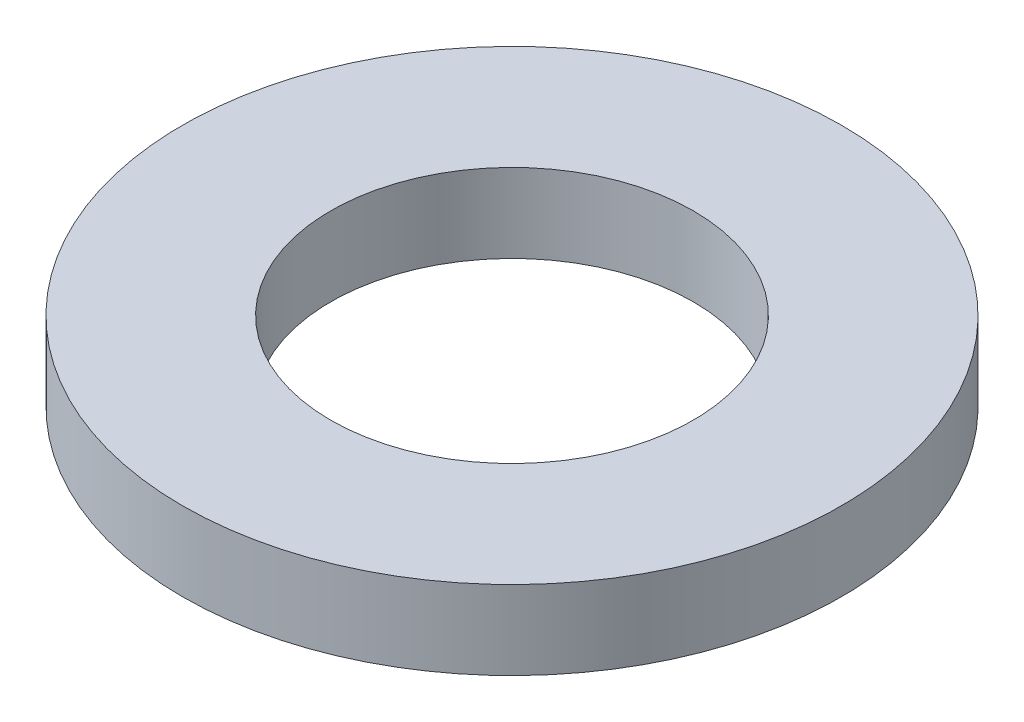
ISO-10303-21;
HEADER;
FILE_DESCRIPTION(('STEP AP214'),'2;1');
FILE_NAME('part.step','',(''),(''),'','','');
FILE_SCHEMA(('AUTOMOTIVE_DESIGN { 1 0 10303 214 1 1 1 1 }'));
ENDSEC;
DATA;
#1=APPLICATION_CONTEXT('core data for automotive mechanical design processes');
#2=APPLICATION_PROTOCOL_DEFINITION('international standard','automotive_design',2000,#1);
#3=PRODUCT_CONTEXT('',#1,'mechanical');
#4=PRODUCT('Part','Part','',(#3));
#5=PRODUCT_RELATED_PRODUCT_CATEGORY('part','',(#4));
#6=PRODUCT_DEFINITION_FORMATION('','',#4);
#7=PRODUCT_DEFINITION_CONTEXT('part definition',#1,'design');
#8=PRODUCT_DEFINITION('design','',#6,#7);
#9=PRODUCT_DEFINITION_SHAPE('','',#8);
#10=(LENGTH_UNIT() NAMED_UNIT(*) SI_UNIT(.MILLI.,.METRE.));
#11=(NAMED_UNIT(*) PLANE_ANGLE_UNIT() SI_UNIT($,.RADIAN.));
#12=(NAMED_UNIT(*) SI_UNIT($,.STERADIAN.) SOLID_ANGLE_UNIT());
#13=UNCERTAINTY_MEASURE_WITH_UNIT(LENGTH_MEASURE(1.E-05),#10,'distance_accuracy_value','');
#14=(GEOMETRIC_REPRESENTATION_CONTEXT(3) GLOBAL_UNCERTAINTY_ASSIGNED_CONTEXT((#13)) GLOBAL_UNIT_ASSIGNED_CONTEXT((#10,
#11,#12)) REPRESENTATION_CONTEXT('',''));
#15=CARTESIAN_POINT('',(0.,0.,0.));
#16=DIRECTION('',(0.,0.,1.));
#17=DIRECTION('',(1.,0.,0.));
#18=AXIS2_PLACEMENT_3D('',#15,#16,#17);
#19=CARTESIAN_POINT('',(0.,0.635,0.));
#20=DIRECTION('',(0.,1.,0.));
#21=DIRECTION('',(0.,0.,1.));
#22=AXIS2_PLACEMENT_3D('',#19,#20,#21);
#23=PLANE('',#22);
#24=CARTESIAN_POINT('',(0.,0.635,0.));
#25=DIRECTION('',(0.,1.,0.));
#26=DIRECTION('',(0.,0.,1.));
#27=AXIS2_PLACEMENT_3D('',#24,#25,#26);
#28=CIRCLE('',#27,2.6543);
#29=CARTESIAN_POINT('',(0.,0.635,2.6543));
#30=VERTEX_POINT('',#29);
#31=EDGE_CURVE('E10',#30,#30,#28,.T.);
#32=ORIENTED_EDGE('',*,*,#31,.T.);
#33=EDGE_LOOP('',(#32));
#34=FACE_BOUND('',#33,.T.);
#35=CARTESIAN_POINT('',(0.,0.635,0.));
#36=DIRECTION('',(0.,1.,0.));
#37=DIRECTION('',(0.,0.,1.));
#38=AXIS2_PLACEMENT_3D('',#35,#36,#37);
#39=CIRCLE('',#38,1.4605);
#40=CARTESIAN_POINT('',(0.,0.635,1.4605));
#41=VERTEX_POINT('',#40);
#42=EDGE_CURVE('E42',#41,#41,#39,.T.);
#43=ORIENTED_EDGE('',*,*,#42,.F.);
#44=EDGE_LOOP('',(#43));
#45=FACE_BOUND('',#44,.T.);
#46=ADVANCED_FACE('F31',(#34,#45),#23,.T.);
#47=CARTESIAN_POINT('',(0.,0.,0.));
#48=DIRECTION('',(0.,1.,0.));
#49=DIRECTION('',(0.,0.,1.));
#50=AXIS2_PLACEMENT_3D('',#47,#48,#49);
#51=PLANE('',#50);
#52=CARTESIAN_POINT('',(0.,0.,0.));
#53=DIRECTION('',(0.,1.,0.));
#54=DIRECTION('',(0.,0.,1.));
#55=AXIS2_PLACEMENT_3D('',#52,#53,#54);
#56=CIRCLE('',#55,2.6543);
#57=CARTESIAN_POINT('',(0.,0.,2.6543));
#58=VERTEX_POINT('',#57);
#59=EDGE_CURVE('E35',#58,#58,#56,.T.);
#60=ORIENTED_EDGE('',*,*,#59,.F.);
#61=EDGE_LOOP('',(#60));
#62=FACE_BOUND('',#61,.T.);
#63=CARTESIAN_POINT('',(0.,0.,0.));
#64=DIRECTION('',(0.,1.,0.));
#65=DIRECTION('',(0.,0.,1.));
#66=AXIS2_PLACEMENT_3D('',#63,#64,#65);
#67=CIRCLE('',#66,1.4605);
#68=CARTESIAN_POINT('',(0.,0.,1.4605));
#69=VERTEX_POINT('',#68);
#70=EDGE_CURVE('E44',#69,#69,#67,.T.);
#71=ORIENTED_EDGE('',*,*,#70,.T.);
#72=EDGE_LOOP('',(#71));
#73=FACE_BOUND('',#72,.T.);
#74=ADVANCED_FACE('F54',(#62,#73),#51,.F.);
#75=CARTESIAN_POINT('',(0.,0.635,0.));
#76=DIRECTION('',(0.,-1.,0.));
#77=DIRECTION('',(0.,0.,-1.));
#78=AXIS2_PLACEMENT_3D('',#75,#76,#77);
#79=CYLINDRICAL_SURFACE('',#78,2.6543);
#80=ORIENTED_EDGE('',*,*,#31,.F.);
#81=EDGE_LOOP('',(#80));
#82=FACE_BOUND('',#81,.T.);
#83=ORIENTED_EDGE('',*,*,#59,.T.);
#84=EDGE_LOOP('',(#83));
#85=FACE_BOUND('',#84,.T.);
#86=ADVANCED_FACE('F33',(#82,#85),#79,.T.);
#87=CARTESIAN_POINT('',(0.,0.635,0.));
#88=DIRECTION('',(0.,-1.,0.));
#89=DIRECTION('',(0.,0.,-1.));
#90=AXIS2_PLACEMENT_3D('',#87,#88,#89);
#91=CYLINDRICAL_SURFACE('',#90,1.4605);
#92=ORIENTED_EDGE('',*,*,#42,.T.);
#93=EDGE_LOOP('',(#92));
#94=FACE_BOUND('',#93,.T.);
#95=ORIENTED_EDGE('',*,*,#70,.F.);
#96=EDGE_LOOP('',(#95));
#97=FACE_BOUND('',#96,.T.);
#98=ADVANCED_FACE('F50',(#94,#97),#91,.F.);
#99=CLOSED_SHELL('',(#46,#74,#86,#98));
#100=MANIFOLD_SOLID_BREP('B2',#99);
#101=ADVANCED_BREP_SHAPE_REPRESENTATION('',(#18,#100),#14);
#102=SHAPE_DEFINITION_REPRESENTATION(#9,#101);
ENDSEC;
END-ISO-10303-21;
